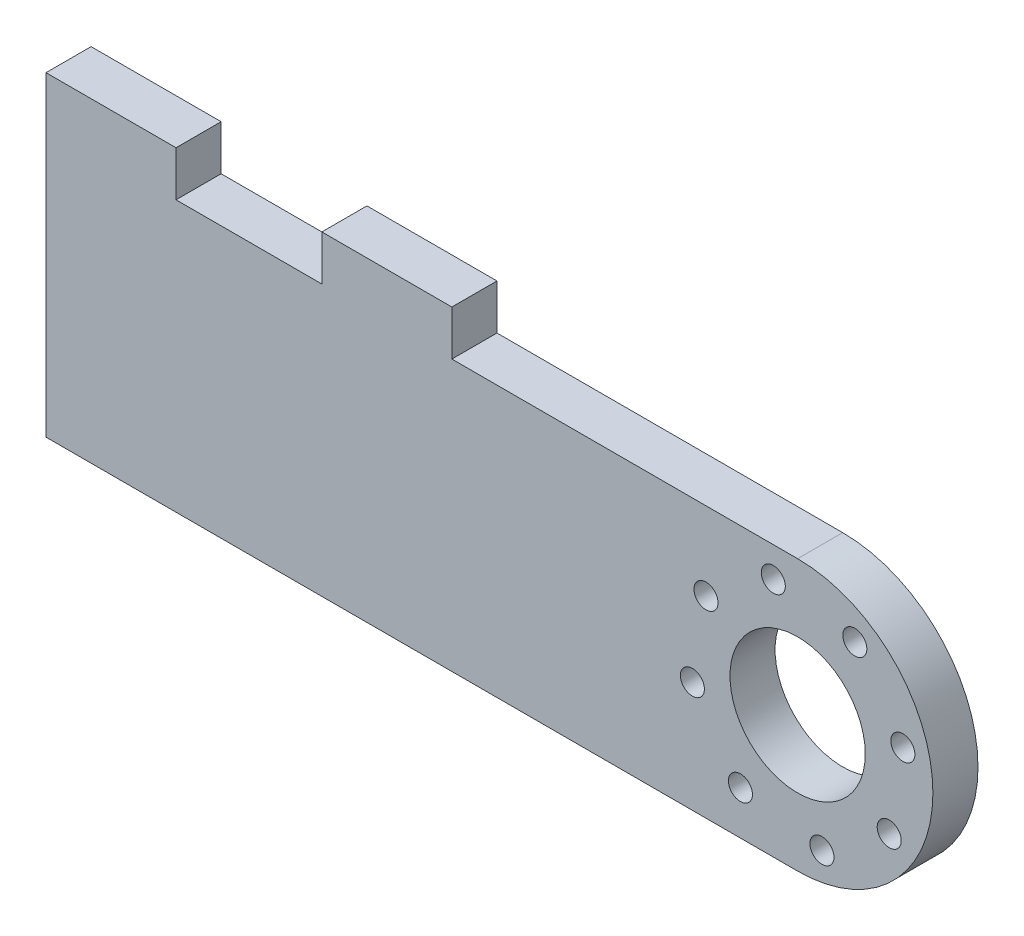
ISO-10303-21;
HEADER;
FILE_DESCRIPTION(('STEP AP214'),'2;1');
FILE_NAME('part.step','',(''),(''),'','','');
FILE_SCHEMA(('AUTOMOTIVE_DESIGN { 1 0 10303 214 1 1 1 1 }'));
ENDSEC;
DATA;
#1=APPLICATION_CONTEXT('core data for automotive mechanical design processes');
#2=APPLICATION_PROTOCOL_DEFINITION('international standard','automotive_design',2000,#1);
#3=PRODUCT_CONTEXT('',#1,'mechanical');
#4=PRODUCT('Part','Part','',(#3));
#5=PRODUCT_RELATED_PRODUCT_CATEGORY('part','',(#4));
#6=PRODUCT_DEFINITION_FORMATION('','',#4);
#7=PRODUCT_DEFINITION_CONTEXT('part definition',#1,'design');
#8=PRODUCT_DEFINITION('design','',#6,#7);
#9=PRODUCT_DEFINITION_SHAPE('','',#8);
#10=(LENGTH_UNIT() NAMED_UNIT(*) SI_UNIT(.MILLI.,.METRE.));
#11=(NAMED_UNIT(*) PLANE_ANGLE_UNIT() SI_UNIT($,.RADIAN.));
#12=(NAMED_UNIT(*) SI_UNIT($,.STERADIAN.) SOLID_ANGLE_UNIT());
#13=UNCERTAINTY_MEASURE_WITH_UNIT(LENGTH_MEASURE(1.E-05),#10,'distance_accuracy_value','');
#14=(GEOMETRIC_REPRESENTATION_CONTEXT(3) GLOBAL_UNCERTAINTY_ASSIGNED_CONTEXT((#13)) GLOBAL_UNIT_ASSIGNED_CONTEXT((#10,
#11,#12)) REPRESENTATION_CONTEXT('',''));
#15=CARTESIAN_POINT('',(0.,0.,0.));
#16=DIRECTION('',(0.,0.,1.));
#17=DIRECTION('',(1.,0.,0.));
#18=AXIS2_PLACEMENT_3D('',#15,#16,#17);
#19=CARTESIAN_POINT('',(24.5978346667474,0.,3.));
#20=DIRECTION('',(0.,0.,-1.));
#21=DIRECTION('',(-1.,0.,0.));
#22=AXIS2_PLACEMENT_3D('',#19,#20,#21);
#23=PLANE('',#22);
#24=DIRECTION('',(-1.,0.,0.));
#25=VECTOR('',#24,1.);
#26=CARTESIAN_POINT('',(1.59783466674739,12.,3.));
#27=LINE('',#26,#25);
#28=CARTESIAN_POINT('',(1.59783466674739,12.,3.));
#29=VERTEX_POINT('',#28);
#30=CARTESIAN_POINT('',(-7.05216533325261,12.,3.));
#31=VERTEX_POINT('',#30);
#32=EDGE_CURVE('E161',#29,#31,#27,.T.);
#33=ORIENTED_EDGE('',*,*,#32,.T.);
#34=DIRECTION('',(0.,-1.,0.));
#35=VECTOR('',#34,1.);
#36=CARTESIAN_POINT('',(-7.05216533325261,12.,3.));
#37=LINE('',#36,#35);
#38=CARTESIAN_POINT('',(-7.05216533325261,9.,3.));
#39=VERTEX_POINT('',#38);
#40=EDGE_CURVE('E99',#31,#39,#37,.T.);
#41=ORIENTED_EDGE('',*,*,#40,.T.);
#42=DIRECTION('',(-1.,0.,0.));
#43=VECTOR('',#42,1.);
#44=CARTESIAN_POINT('',(-7.05216533325261,9.,3.));
#45=LINE('',#44,#43);
#46=CARTESIAN_POINT('',(-16.7521653332526,8.99999999999999,3.));
#47=VERTEX_POINT('',#46);
#48=EDGE_CURVE('E182',#39,#47,#45,.T.);
#49=ORIENTED_EDGE('',*,*,#48,.T.);
#50=DIRECTION('',(0.,1.,0.));
#51=VECTOR('',#50,1.);
#52=CARTESIAN_POINT('',(-16.7521653332526,8.99999999999999,3.));
#53=LINE('',#52,#51);
#54=CARTESIAN_POINT('',(-16.7521653332526,12.,3.));
#55=VERTEX_POINT('',#54);
#56=EDGE_CURVE('E201',#47,#55,#53,.T.);
#57=ORIENTED_EDGE('',*,*,#56,.T.);
#58=DIRECTION('',(-1.,0.,0.));
#59=VECTOR('',#58,1.);
#60=CARTESIAN_POINT('',(-16.7521653332526,12.,3.));
#61=LINE('',#60,#59);
#62=CARTESIAN_POINT('',(-25.4021653332526,12.,3.));
#63=VERTEX_POINT('',#62);
#64=EDGE_CURVE('E198',#55,#63,#61,.T.);
#65=ORIENTED_EDGE('',*,*,#64,.T.);
#66=DIRECTION('',(0.,-1.,0.));
#67=VECTOR('',#66,1.);
#68=CARTESIAN_POINT('',(-25.4021653332526,12.,3.));
#69=LINE('',#68,#67);
#70=CARTESIAN_POINT('',(-25.4021653332526,-9.,3.));
#71=VERTEX_POINT('',#70);
#72=EDGE_CURVE('E200',#63,#71,#69,.T.);
#73=ORIENTED_EDGE('',*,*,#72,.T.);
#74=DIRECTION('',(1.,0.,0.));
#75=VECTOR('',#74,1.);
#76=CARTESIAN_POINT('',(-25.4021653332526,-9.,3.));
#77=LINE('',#76,#75);
#78=CARTESIAN_POINT('',(24.5978346667474,-9.,3.));
#79=VERTEX_POINT('',#78);
#80=EDGE_CURVE('E124',#71,#79,#77,.T.);
#81=ORIENTED_EDGE('',*,*,#80,.T.);
#82=CARTESIAN_POINT('',(24.5978346667474,0.,3.));
#83=DIRECTION('',(0.,0.,1.));
#84=DIRECTION('',(-1.,0.,0.));
#85=AXIS2_PLACEMENT_3D('',#82,#83,#84);
#86=CIRCLE('',#85,9.);
#87=CARTESIAN_POINT('',(24.5978346667474,9.,3.));
#88=VERTEX_POINT('',#87);
#89=EDGE_CURVE('E118',#79,#88,#86,.T.);
#90=ORIENTED_EDGE('',*,*,#89,.T.);
#91=DIRECTION('',(-1.,0.,0.));
#92=VECTOR('',#91,1.);
#93=CARTESIAN_POINT('',(1.59783466674739,9.,3.));
#94=LINE('',#93,#92);
#95=CARTESIAN_POINT('',(1.59783466674739,9.,3.));
#96=VERTEX_POINT('',#95);
#97=EDGE_CURVE('E122',#88,#96,#94,.T.);
#98=ORIENTED_EDGE('',*,*,#97,.T.);
#99=DIRECTION('',(0.,1.,0.));
#100=VECTOR('',#99,1.);
#101=CARTESIAN_POINT('',(1.59783466674739,9.,3.));
#102=LINE('',#101,#100);
#103=EDGE_CURVE('E50',#96,#29,#102,.T.);
#104=ORIENTED_EDGE('',*,*,#103,.T.);
#105=EDGE_LOOP('',(#33,#41,#49,#57,#65,#73,#81,#90,#98,#104));
#106=FACE_BOUND('',#105,.T.);
#107=CARTESIAN_POINT('',(24.5978346667474,0.,3.));
#108=DIRECTION('',(0.,0.,1.));
#109=DIRECTION('',(1.,0.,0.));
#110=AXIS2_PLACEMENT_3D('',#107,#108,#109);
#111=CIRCLE('',#110,4.5);
#112=CARTESIAN_POINT('',(29.0978346667474,0.,3.));
#113=VERTEX_POINT('',#112);
#114=EDGE_CURVE('E146',#113,#113,#111,.T.);
#115=ORIENTED_EDGE('',*,*,#114,.F.);
#116=EDGE_LOOP('',(#115));
#117=FACE_BOUND('',#116,.T.);
#118=CARTESIAN_POINT('',(22.9790707898904,7.,3.));
#119=DIRECTION('',(0.,0.,1.));
#120=DIRECTION('',(1.,0.,0.));
#121=AXIS2_PLACEMENT_3D('',#118,#119,#120);
#122=CIRCLE('',#121,0.799999999999999);
#123=CARTESIAN_POINT('',(23.7790707898904,7.,3.));
#124=VERTEX_POINT('',#123);
#125=EDGE_CURVE('E212',#124,#124,#122,.T.);
#126=ORIENTED_EDGE('',*,*,#125,.F.);
#127=EDGE_LOOP('',(#126));
#128=FACE_BOUND('',#127,.T.);
#129=CARTESIAN_POINT('',(28.4029432205878,6.09438638277143,3.));
#130=DIRECTION('',(0.,0.,1.));
#131=DIRECTION('',(1.,0.,0.));
#132=AXIS2_PLACEMENT_3D('',#129,#130,#131);
#133=CIRCLE('',#132,0.799999999999999);
#134=CARTESIAN_POINT('',(29.2029432205878,6.09438638277143,3.));
#135=VERTEX_POINT('',#134);
#136=EDGE_CURVE('E218',#135,#135,#133,.T.);
#137=ORIENTED_EDGE('',*,*,#136,.F.);
#138=EDGE_LOOP('',(#137));
#139=FACE_BOUND('',#138,.T.);
#140=CARTESIAN_POINT('',(31.5978346667476,1.61876387685727,3.));
#141=DIRECTION('',(0.,0.,1.));
#142=DIRECTION('',(1.,0.,0.));
#143=AXIS2_PLACEMENT_3D('',#140,#141,#142);
#144=CIRCLE('',#143,0.799999999999998);
#145=CARTESIAN_POINT('',(32.3978346667475,1.61876387685727,3.));
#146=VERTEX_POINT('',#145);
#147=EDGE_CURVE('E224',#146,#146,#144,.T.);
#148=ORIENTED_EDGE('',*,*,#147,.F.);
#149=EDGE_LOOP('',(#148));
#150=FACE_BOUND('',#149,.T.);
#151=CARTESIAN_POINT('',(30.6922210495189,-3.8051085538402,3.));
#152=DIRECTION('',(0.,0.,1.));
#153=DIRECTION('',(1.,0.,0.));
#154=AXIS2_PLACEMENT_3D('',#151,#152,#153);
#155=CIRCLE('',#154,0.799999999999999);
#156=CARTESIAN_POINT('',(31.492221049519,-3.8051085538402,3.));
#157=VERTEX_POINT('',#156);
#158=EDGE_CURVE('E230',#157,#157,#155,.T.);
#159=ORIENTED_EDGE('',*,*,#158,.F.);
#160=EDGE_LOOP('',(#159));
#161=FACE_BOUND('',#160,.T.);
#162=CARTESIAN_POINT('',(26.2165985436048,-6.99999999999992,3.));
#163=DIRECTION('',(0.,0.,1.));
#164=DIRECTION('',(1.,0.,0.));
#165=AXIS2_PLACEMENT_3D('',#162,#163,#164);
#166=CIRCLE('',#165,0.800000000000001);
#167=CARTESIAN_POINT('',(27.0165985436048,-6.99999999999992,3.));
#168=VERTEX_POINT('',#167);
#169=EDGE_CURVE('E236',#168,#168,#166,.T.);
#170=ORIENTED_EDGE('',*,*,#169,.F.);
#171=EDGE_LOOP('',(#170));
#172=FACE_BOUND('',#171,.T.);
#173=CARTESIAN_POINT('',(20.7927261129073,-6.09438638277132,3.));
#174=DIRECTION('',(0.,0.,1.));
#175=DIRECTION('',(1.,0.,0.));
#176=AXIS2_PLACEMENT_3D('',#173,#174,#175);
#177=CIRCLE('',#176,0.799999999999999);
#178=CARTESIAN_POINT('',(21.5927261129073,-6.09438638277132,3.));
#179=VERTEX_POINT('',#178);
#180=EDGE_CURVE('E242',#179,#179,#177,.T.);
#181=ORIENTED_EDGE('',*,*,#180,.F.);
#182=EDGE_LOOP('',(#181));
#183=FACE_BOUND('',#182,.T.);
#184=CARTESIAN_POINT('',(17.5978346667476,-1.61876387685712,3.));
#185=DIRECTION('',(0.,0.,1.));
#186=DIRECTION('',(1.,0.,0.));
#187=AXIS2_PLACEMENT_3D('',#184,#185,#186);
#188=CIRCLE('',#187,0.8);
#189=CARTESIAN_POINT('',(18.3978346667476,-1.61876387685712,3.));
#190=VERTEX_POINT('',#189);
#191=EDGE_CURVE('E248',#190,#190,#188,.T.);
#192=ORIENTED_EDGE('',*,*,#191,.F.);
#193=EDGE_LOOP('',(#192));
#194=FACE_BOUND('',#193,.T.);
#195=CARTESIAN_POINT('',(18.5034482839763,3.80510855384034,3.));
#196=DIRECTION('',(0.,0.,1.));
#197=DIRECTION('',(1.,0.,0.));
#198=AXIS2_PLACEMENT_3D('',#195,#196,#197);
#199=CIRCLE('',#198,0.799999999999999);
#200=CARTESIAN_POINT('',(19.3034482839763,3.80510855384034,3.));
#201=VERTEX_POINT('',#200);
#202=EDGE_CURVE('E254',#201,#201,#199,.T.);
#203=ORIENTED_EDGE('',*,*,#202,.F.);
#204=EDGE_LOOP('',(#203));
#205=FACE_BOUND('',#204,.T.);
#206=ADVANCED_FACE('F33',(#106,#117,#128,#139,#150,#161,#172,#183,#194,#205),#23,.F.);
#207=CARTESIAN_POINT('',(24.5978346667474,0.,0.));
#208=DIRECTION('',(0.,0.,-1.));
#209=DIRECTION('',(-1.,0.,0.));
#210=AXIS2_PLACEMENT_3D('',#207,#208,#209);
#211=PLANE('',#210);
#212=CARTESIAN_POINT('',(17.5978346667476,-1.61876387685712,0.));
#213=DIRECTION('',(0.,0.,1.));
#214=DIRECTION('',(1.,0.,0.));
#215=AXIS2_PLACEMENT_3D('',#212,#213,#214);
#216=CIRCLE('',#215,0.8);
#217=CARTESIAN_POINT('',(18.3978346667476,-1.61876387685712,0.));
#218=VERTEX_POINT('',#217);
#219=EDGE_CURVE('E251',#218,#218,#216,.T.);
#220=ORIENTED_EDGE('',*,*,#219,.T.);
#221=EDGE_LOOP('',(#220));
#222=FACE_BOUND('',#221,.T.);
#223=CARTESIAN_POINT('',(26.2165985436048,-6.99999999999992,0.));
#224=DIRECTION('',(0.,0.,1.));
#225=DIRECTION('',(1.,0.,0.));
#226=AXIS2_PLACEMENT_3D('',#223,#224,#225);
#227=CIRCLE('',#226,0.800000000000001);
#228=CARTESIAN_POINT('',(27.0165985436048,-6.99999999999992,0.));
#229=VERTEX_POINT('',#228);
#230=EDGE_CURVE('E239',#229,#229,#227,.T.);
#231=ORIENTED_EDGE('',*,*,#230,.T.);
#232=EDGE_LOOP('',(#231));
#233=FACE_BOUND('',#232,.T.);
#234=CARTESIAN_POINT('',(31.5978346667476,1.61876387685727,0.));
#235=DIRECTION('',(0.,0.,1.));
#236=DIRECTION('',(1.,0.,0.));
#237=AXIS2_PLACEMENT_3D('',#234,#235,#236);
#238=CIRCLE('',#237,0.799999999999998);
#239=CARTESIAN_POINT('',(32.3978346667475,1.61876387685727,0.));
#240=VERTEX_POINT('',#239);
#241=EDGE_CURVE('E227',#240,#240,#238,.T.);
#242=ORIENTED_EDGE('',*,*,#241,.T.);
#243=EDGE_LOOP('',(#242));
#244=FACE_BOUND('',#243,.T.);
#245=CARTESIAN_POINT('',(22.9790707898904,7.,0.));
#246=DIRECTION('',(0.,0.,1.));
#247=DIRECTION('',(1.,0.,0.));
#248=AXIS2_PLACEMENT_3D('',#245,#246,#247);
#249=CIRCLE('',#248,0.799999999999999);
#250=CARTESIAN_POINT('',(23.7790707898904,7.,0.));
#251=VERTEX_POINT('',#250);
#252=EDGE_CURVE('E215',#251,#251,#249,.T.);
#253=ORIENTED_EDGE('',*,*,#252,.T.);
#254=EDGE_LOOP('',(#253));
#255=FACE_BOUND('',#254,.T.);
#256=DIRECTION('',(-1.,0.,0.));
#257=VECTOR('',#256,1.);
#258=CARTESIAN_POINT('',(1.59783466674739,12.,0.));
#259=LINE('',#258,#257);
#260=CARTESIAN_POINT('',(1.59783466674739,12.,0.));
#261=VERTEX_POINT('',#260);
#262=CARTESIAN_POINT('',(-7.05216533325261,12.,0.));
#263=VERTEX_POINT('',#262);
#264=EDGE_CURVE('E142',#261,#263,#259,.T.);
#265=ORIENTED_EDGE('',*,*,#264,.F.);
#266=DIRECTION('',(0.,1.,0.));
#267=VECTOR('',#266,1.);
#268=CARTESIAN_POINT('',(1.59783466674739,9.,0.));
#269=LINE('',#268,#267);
#270=CARTESIAN_POINT('',(1.59783466674739,9.,0.));
#271=VERTEX_POINT('',#270);
#272=EDGE_CURVE('E91',#271,#261,#269,.T.);
#273=ORIENTED_EDGE('',*,*,#272,.F.);
#274=DIRECTION('',(-1.,0.,0.));
#275=VECTOR('',#274,1.);
#276=CARTESIAN_POINT('',(1.59783466674739,9.,0.));
#277=LINE('',#276,#275);
#278=CARTESIAN_POINT('',(24.5978346667474,9.,0.));
#279=VERTEX_POINT('',#278);
#280=EDGE_CURVE('E85',#279,#271,#277,.T.);
#281=ORIENTED_EDGE('',*,*,#280,.F.);
#282=CARTESIAN_POINT('',(24.5978346667474,0.,0.));
#283=DIRECTION('',(0.,0.,1.));
#284=DIRECTION('',(-1.,0.,0.));
#285=AXIS2_PLACEMENT_3D('',#282,#283,#284);
#286=CIRCLE('',#285,9.);
#287=CARTESIAN_POINT('',(24.5978346667474,-9.,0.));
#288=VERTEX_POINT('',#287);
#289=EDGE_CURVE('E132',#288,#279,#286,.T.);
#290=ORIENTED_EDGE('',*,*,#289,.F.);
#291=DIRECTION('',(1.,0.,0.));
#292=VECTOR('',#291,1.);
#293=CARTESIAN_POINT('',(-25.4021653332526,-9.,0.));
#294=LINE('',#293,#292);
#295=CARTESIAN_POINT('',(-25.4021653332526,-9.,0.));
#296=VERTEX_POINT('',#295);
#297=EDGE_CURVE('E156',#296,#288,#294,.T.);
#298=ORIENTED_EDGE('',*,*,#297,.F.);
#299=DIRECTION('',(0.,-1.,0.));
#300=VECTOR('',#299,1.);
#301=CARTESIAN_POINT('',(-25.4021653332526,12.,0.));
#302=LINE('',#301,#300);
#303=CARTESIAN_POINT('',(-25.4021653332526,12.,0.));
#304=VERTEX_POINT('',#303);
#305=EDGE_CURVE('E154',#304,#296,#302,.T.);
#306=ORIENTED_EDGE('',*,*,#305,.F.);
#307=DIRECTION('',(-1.,0.,0.));
#308=VECTOR('',#307,1.);
#309=CARTESIAN_POINT('',(-16.7521653332526,12.,0.));
#310=LINE('',#309,#308);
#311=CARTESIAN_POINT('',(-16.7521653332526,12.,0.));
#312=VERTEX_POINT('',#311);
#313=EDGE_CURVE('E152',#312,#304,#310,.T.);
#314=ORIENTED_EDGE('',*,*,#313,.F.);
#315=DIRECTION('',(0.,1.,0.));
#316=VECTOR('',#315,1.);
#317=CARTESIAN_POINT('',(-16.7521653332526,8.99999999999999,0.));
#318=LINE('',#317,#316);
#319=CARTESIAN_POINT('',(-16.7521653332526,8.99999999999999,0.));
#320=VERTEX_POINT('',#319);
#321=EDGE_CURVE('E150',#320,#312,#318,.T.);
#322=ORIENTED_EDGE('',*,*,#321,.F.);
#323=DIRECTION('',(-1.,0.,0.));
#324=VECTOR('',#323,1.);
#325=CARTESIAN_POINT('',(-7.05216533325261,9.,0.));
#326=LINE('',#325,#324);
#327=CARTESIAN_POINT('',(-7.05216533325261,9.,0.));
#328=VERTEX_POINT('',#327);
#329=EDGE_CURVE('E148',#328,#320,#326,.T.);
#330=ORIENTED_EDGE('',*,*,#329,.F.);
#331=DIRECTION('',(0.,-1.,0.));
#332=VECTOR('',#331,1.);
#333=CARTESIAN_POINT('',(-7.05216533325261,12.,0.));
#334=LINE('',#333,#332);
#335=EDGE_CURVE('E145',#263,#328,#334,.T.);
#336=ORIENTED_EDGE('',*,*,#335,.F.);
#337=EDGE_LOOP('',(#265,#273,#281,#290,#298,#306,#314,#322,#330,#336));
#338=FACE_BOUND('',#337,.T.);
#339=CARTESIAN_POINT('',(24.5978346667474,0.,0.));
#340=DIRECTION('',(0.,0.,1.));
#341=DIRECTION('',(1.,0.,0.));
#342=AXIS2_PLACEMENT_3D('',#339,#340,#341);
#343=CIRCLE('',#342,4.5);
#344=CARTESIAN_POINT('',(29.0978346667474,0.,0.));
#345=VERTEX_POINT('',#344);
#346=EDGE_CURVE('E209',#345,#345,#343,.T.);
#347=ORIENTED_EDGE('',*,*,#346,.T.);
#348=EDGE_LOOP('',(#347));
#349=FACE_BOUND('',#348,.T.);
#350=CARTESIAN_POINT('',(28.4029432205878,6.09438638277143,0.));
#351=DIRECTION('',(0.,0.,1.));
#352=DIRECTION('',(1.,0.,0.));
#353=AXIS2_PLACEMENT_3D('',#350,#351,#352);
#354=CIRCLE('',#353,0.799999999999999);
#355=CARTESIAN_POINT('',(29.2029432205878,6.09438638277143,0.));
#356=VERTEX_POINT('',#355);
#357=EDGE_CURVE('E221',#356,#356,#354,.T.);
#358=ORIENTED_EDGE('',*,*,#357,.T.);
#359=EDGE_LOOP('',(#358));
#360=FACE_BOUND('',#359,.T.);
#361=CARTESIAN_POINT('',(30.6922210495189,-3.8051085538402,0.));
#362=DIRECTION('',(0.,0.,1.));
#363=DIRECTION('',(1.,0.,0.));
#364=AXIS2_PLACEMENT_3D('',#361,#362,#363);
#365=CIRCLE('',#364,0.799999999999999);
#366=CARTESIAN_POINT('',(31.492221049519,-3.8051085538402,0.));
#367=VERTEX_POINT('',#366);
#368=EDGE_CURVE('E233',#367,#367,#365,.T.);
#369=ORIENTED_EDGE('',*,*,#368,.T.);
#370=EDGE_LOOP('',(#369));
#371=FACE_BOUND('',#370,.T.);
#372=CARTESIAN_POINT('',(20.7927261129073,-6.09438638277132,0.));
#373=DIRECTION('',(0.,0.,1.));
#374=DIRECTION('',(1.,0.,0.));
#375=AXIS2_PLACEMENT_3D('',#372,#373,#374);
#376=CIRCLE('',#375,0.799999999999999);
#377=CARTESIAN_POINT('',(21.5927261129073,-6.09438638277132,0.));
#378=VERTEX_POINT('',#377);
#379=EDGE_CURVE('E245',#378,#378,#376,.T.);
#380=ORIENTED_EDGE('',*,*,#379,.T.);
#381=EDGE_LOOP('',(#380));
#382=FACE_BOUND('',#381,.T.);
#383=CARTESIAN_POINT('',(18.5034482839763,3.80510855384034,0.));
#384=DIRECTION('',(0.,0.,1.));
#385=DIRECTION('',(1.,0.,0.));
#386=AXIS2_PLACEMENT_3D('',#383,#384,#385);
#387=CIRCLE('',#386,0.799999999999999);
#388=CARTESIAN_POINT('',(19.3034482839763,3.80510855384034,0.));
#389=VERTEX_POINT('',#388);
#390=EDGE_CURVE('E257',#389,#389,#387,.T.);
#391=ORIENTED_EDGE('',*,*,#390,.T.);
#392=EDGE_LOOP('',(#391));
#393=FACE_BOUND('',#392,.T.);
#394=ADVANCED_FACE('F186',(#222,#233,#244,#255,#338,#349,#360,#371,#382,#393),#211,.T.);
#395=CARTESIAN_POINT('',(1.59783466674739,12.,3.));
#396=DIRECTION('',(0.,-1.,0.));
#397=DIRECTION('',(1.,0.,0.));
#398=AXIS2_PLACEMENT_3D('',#395,#396,#397);
#399=PLANE('',#398);
#400=ORIENTED_EDGE('',*,*,#264,.T.);
#401=DIRECTION('',(0.,0.,-1.));
#402=VECTOR('',#401,1.);
#403=CARTESIAN_POINT('',(-7.05216533325261,12.,3.));
#404=LINE('',#403,#402);
#405=EDGE_CURVE('E11',#31,#263,#404,.T.);
#406=ORIENTED_EDGE('',*,*,#405,.F.);
#407=ORIENTED_EDGE('',*,*,#32,.F.);
#408=DIRECTION('',(0.,0.,-1.));
#409=VECTOR('',#408,1.);
#410=CARTESIAN_POINT('',(1.59783466674739,12.,3.));
#411=LINE('',#410,#409);
#412=EDGE_CURVE('E138',#29,#261,#411,.T.);
#413=ORIENTED_EDGE('',*,*,#412,.T.);
#414=EDGE_LOOP('',(#400,#406,#407,#413));
#415=FACE_BOUND('',#414,.T.);
#416=ADVANCED_FACE('F35',(#415),#399,.F.);
#417=CARTESIAN_POINT('',(-7.05216533325261,12.,3.));
#418=DIRECTION('',(1.,0.,0.));
#419=DIRECTION('',(0.,0.,-1.));
#420=AXIS2_PLACEMENT_3D('',#417,#418,#419);
#421=PLANE('',#420);
#422=ORIENTED_EDGE('',*,*,#335,.T.);
#423=DIRECTION('',(0.,0.,-1.));
#424=VECTOR('',#423,1.);
#425=CARTESIAN_POINT('',(-7.05216533325261,9.,3.));
#426=LINE('',#425,#424);
#427=EDGE_CURVE('E42',#39,#328,#426,.T.);
#428=ORIENTED_EDGE('',*,*,#427,.F.);
#429=ORIENTED_EDGE('',*,*,#40,.F.);
#430=ORIENTED_EDGE('',*,*,#405,.T.);
#431=EDGE_LOOP('',(#422,#428,#429,#430));
#432=FACE_BOUND('',#431,.T.);
#433=ADVANCED_FACE('F297',(#432),#421,.F.);
#434=CARTESIAN_POINT('',(-7.05216533325261,9.,3.));
#435=DIRECTION('',(0.,-1.,0.));
#436=DIRECTION('',(1.,0.,0.));
#437=AXIS2_PLACEMENT_3D('',#434,#435,#436);
#438=PLANE('',#437);
#439=ORIENTED_EDGE('',*,*,#329,.T.);
#440=DIRECTION('',(0.,0.,-1.));
#441=VECTOR('',#440,1.);
#442=CARTESIAN_POINT('',(-16.7521653332526,8.99999999999999,3.));
#443=LINE('',#442,#441);
#444=EDGE_CURVE('E174',#47,#320,#443,.T.);
#445=ORIENTED_EDGE('',*,*,#444,.F.);
#446=ORIENTED_EDGE('',*,*,#48,.F.);
#447=ORIENTED_EDGE('',*,*,#427,.T.);
#448=EDGE_LOOP('',(#439,#445,#446,#447));
#449=FACE_BOUND('',#448,.T.);
#450=ADVANCED_FACE('F180',(#449),#438,.F.);
#451=CARTESIAN_POINT('',(-16.7521653332526,8.99999999999999,3.));
#452=DIRECTION('',(-1.,0.,0.));
#453=DIRECTION('',(0.,0.,1.));
#454=AXIS2_PLACEMENT_3D('',#451,#452,#453);
#455=PLANE('',#454);
#456=ORIENTED_EDGE('',*,*,#321,.T.);
#457=DIRECTION('',(0.,0.,-1.));
#458=VECTOR('',#457,1.);
#459=CARTESIAN_POINT('',(-16.7521653332526,12.,3.));
#460=LINE('',#459,#458);
#461=EDGE_CURVE('E171',#55,#312,#460,.T.);
#462=ORIENTED_EDGE('',*,*,#461,.F.);
#463=ORIENTED_EDGE('',*,*,#56,.F.);
#464=ORIENTED_EDGE('',*,*,#444,.T.);
#465=EDGE_LOOP('',(#456,#462,#463,#464));
#466=FACE_BOUND('',#465,.T.);
#467=ADVANCED_FACE('F192',(#466),#455,.F.);
#468=CARTESIAN_POINT('',(-16.7521653332526,12.,3.));
#469=DIRECTION('',(0.,-1.,0.));
#470=DIRECTION('',(0.,0.,-1.));
#471=AXIS2_PLACEMENT_3D('',#468,#469,#470);
#472=PLANE('',#471);
#473=ORIENTED_EDGE('',*,*,#313,.T.);
#474=DIRECTION('',(0.,0.,-1.));
#475=VECTOR('',#474,1.);
#476=CARTESIAN_POINT('',(-25.4021653332526,12.,3.));
#477=LINE('',#476,#475);
#478=EDGE_CURVE('E168',#63,#304,#477,.T.);
#479=ORIENTED_EDGE('',*,*,#478,.F.);
#480=ORIENTED_EDGE('',*,*,#64,.F.);
#481=ORIENTED_EDGE('',*,*,#461,.T.);
#482=EDGE_LOOP('',(#473,#479,#480,#481));
#483=FACE_BOUND('',#482,.T.);
#484=ADVANCED_FACE('F196',(#483),#472,.F.);
#485=CARTESIAN_POINT('',(-25.4021653332526,12.,3.));
#486=DIRECTION('',(1.,0.,0.));
#487=DIRECTION('',(0.,1.,0.));
#488=AXIS2_PLACEMENT_3D('',#485,#486,#487);
#489=PLANE('',#488);
#490=ORIENTED_EDGE('',*,*,#305,.T.);
#491=DIRECTION('',(0.,0.,-1.));
#492=VECTOR('',#491,1.);
#493=CARTESIAN_POINT('',(-25.4021653332526,-9.,3.));
#494=LINE('',#493,#492);
#495=EDGE_CURVE('E165',#71,#296,#494,.T.);
#496=ORIENTED_EDGE('',*,*,#495,.F.);
#497=ORIENTED_EDGE('',*,*,#72,.F.);
#498=ORIENTED_EDGE('',*,*,#478,.T.);
#499=EDGE_LOOP('',(#490,#496,#497,#498));
#500=FACE_BOUND('',#499,.T.);
#501=ADVANCED_FACE('F287',(#500),#489,.F.);
#502=CARTESIAN_POINT('',(-25.4021653332526,-9.,3.));
#503=DIRECTION('',(0.,1.,0.));
#504=DIRECTION('',(-1.,0.,0.));
#505=AXIS2_PLACEMENT_3D('',#502,#503,#504);
#506=PLANE('',#505);
#507=ORIENTED_EDGE('',*,*,#297,.T.);
#508=DIRECTION('',(0.,0.,-1.));
#509=VECTOR('',#508,1.);
#510=CARTESIAN_POINT('',(24.5978346667474,-9.,3.));
#511=LINE('',#510,#509);
#512=EDGE_CURVE('E133',#79,#288,#511,.T.);
#513=ORIENTED_EDGE('',*,*,#512,.F.);
#514=ORIENTED_EDGE('',*,*,#80,.F.);
#515=ORIENTED_EDGE('',*,*,#495,.T.);
#516=EDGE_LOOP('',(#507,#513,#514,#515));
#517=FACE_BOUND('',#516,.T.);
#518=ADVANCED_FACE('F284',(#517),#506,.F.);
#519=CARTESIAN_POINT('',(24.5978346667474,0.,3.));
#520=DIRECTION('',(0.,0.,-1.));
#521=DIRECTION('',(-1.,0.,0.));
#522=AXIS2_PLACEMENT_3D('',#519,#520,#521);
#523=CYLINDRICAL_SURFACE('',#522,9.);
#524=ORIENTED_EDGE('',*,*,#289,.T.);
#525=DIRECTION('',(0.,0.,-1.));
#526=VECTOR('',#525,1.);
#527=CARTESIAN_POINT('',(24.5978346667474,9.,3.));
#528=LINE('',#527,#526);
#529=EDGE_CURVE('E129',#88,#279,#528,.T.);
#530=ORIENTED_EDGE('',*,*,#529,.F.);
#531=ORIENTED_EDGE('',*,*,#89,.F.);
#532=ORIENTED_EDGE('',*,*,#512,.T.);
#533=EDGE_LOOP('',(#524,#530,#531,#532));
#534=FACE_BOUND('',#533,.T.);
#535=ADVANCED_FACE('F130',(#534),#523,.T.);
#536=CARTESIAN_POINT('',(1.59783466674739,9.,3.));
#537=DIRECTION('',(0.,-1.,0.));
#538=DIRECTION('',(1.,0.,0.));
#539=AXIS2_PLACEMENT_3D('',#536,#537,#538);
#540=PLANE('',#539);
#541=ORIENTED_EDGE('',*,*,#280,.T.);
#542=DIRECTION('',(0.,0.,-1.));
#543=VECTOR('',#542,1.);
#544=CARTESIAN_POINT('',(1.59783466674739,9.,3.));
#545=LINE('',#544,#543);
#546=EDGE_CURVE('E134',#96,#271,#545,.T.);
#547=ORIENTED_EDGE('',*,*,#546,.F.);
#548=ORIENTED_EDGE('',*,*,#97,.F.);
#549=ORIENTED_EDGE('',*,*,#529,.T.);
#550=EDGE_LOOP('',(#541,#547,#548,#549));
#551=FACE_BOUND('',#550,.T.);
#552=ADVANCED_FACE('F136',(#551),#540,.F.);
#553=CARTESIAN_POINT('',(1.59783466674739,9.,3.));
#554=DIRECTION('',(-1.,0.,0.));
#555=DIRECTION('',(0.,-1.,0.));
#556=AXIS2_PLACEMENT_3D('',#553,#554,#555);
#557=PLANE('',#556);
#558=ORIENTED_EDGE('',*,*,#272,.T.);
#559=ORIENTED_EDGE('',*,*,#412,.F.);
#560=ORIENTED_EDGE('',*,*,#103,.F.);
#561=ORIENTED_EDGE('',*,*,#546,.T.);
#562=EDGE_LOOP('',(#558,#559,#560,#561));
#563=FACE_BOUND('',#562,.T.);
#564=ADVANCED_FACE('F277',(#563),#557,.F.);
#565=CARTESIAN_POINT('',(24.5978346667474,0.,3.));
#566=DIRECTION('',(0.,0.,-1.));
#567=DIRECTION('',(-1.,0.,0.));
#568=AXIS2_PLACEMENT_3D('',#565,#566,#567);
#569=CYLINDRICAL_SURFACE('',#568,4.5);
#570=ORIENTED_EDGE('',*,*,#114,.T.);
#571=EDGE_LOOP('',(#570));
#572=FACE_BOUND('',#571,.T.);
#573=ORIENTED_EDGE('',*,*,#346,.F.);
#574=EDGE_LOOP('',(#573));
#575=FACE_BOUND('',#574,.T.);
#576=ADVANCED_FACE('F274',(#572,#575),#569,.F.);
#577=CARTESIAN_POINT('',(22.9790707898904,7.,3.));
#578=DIRECTION('',(0.,0.,-1.));
#579=DIRECTION('',(-1.,0.,0.));
#580=AXIS2_PLACEMENT_3D('',#577,#578,#579);
#581=CYLINDRICAL_SURFACE('',#580,0.799999999999999);
#582=ORIENTED_EDGE('',*,*,#125,.T.);
#583=EDGE_LOOP('',(#582));
#584=FACE_BOUND('',#583,.T.);
#585=ORIENTED_EDGE('',*,*,#252,.F.);
#586=EDGE_LOOP('',(#585));
#587=FACE_BOUND('',#586,.T.);
#588=ADVANCED_FACE('F373',(#584,#587),#581,.F.);
#589=CARTESIAN_POINT('',(28.4029432205878,6.09438638277143,3.));
#590=DIRECTION('',(0.,0.,-1.));
#591=DIRECTION('',(-1.,0.,0.));
#592=AXIS2_PLACEMENT_3D('',#589,#590,#591);
#593=CYLINDRICAL_SURFACE('',#592,0.799999999999999);
#594=ORIENTED_EDGE('',*,*,#136,.T.);
#595=EDGE_LOOP('',(#594));
#596=FACE_BOUND('',#595,.T.);
#597=ORIENTED_EDGE('',*,*,#357,.F.);
#598=EDGE_LOOP('',(#597));
#599=FACE_BOUND('',#598,.T.);
#600=ADVANCED_FACE('F381',(#596,#599),#593,.F.);
#601=CARTESIAN_POINT('',(31.5978346667476,1.61876387685727,3.));
#602=DIRECTION('',(0.,0.,-1.));
#603=DIRECTION('',(-1.,0.,0.));
#604=AXIS2_PLACEMENT_3D('',#601,#602,#603);
#605=CYLINDRICAL_SURFACE('',#604,0.799999999999998);
#606=ORIENTED_EDGE('',*,*,#147,.T.);
#607=EDGE_LOOP('',(#606));
#608=FACE_BOUND('',#607,.T.);
#609=ORIENTED_EDGE('',*,*,#241,.F.);
#610=EDGE_LOOP('',(#609));
#611=FACE_BOUND('',#610,.T.);
#612=ADVANCED_FACE('F389',(#608,#611),#605,.F.);
#613=CARTESIAN_POINT('',(30.6922210495189,-3.8051085538402,3.));
#614=DIRECTION('',(0.,0.,-1.));
#615=DIRECTION('',(-1.,0.,0.));
#616=AXIS2_PLACEMENT_3D('',#613,#614,#615);
#617=CYLINDRICAL_SURFACE('',#616,0.799999999999999);
#618=ORIENTED_EDGE('',*,*,#158,.T.);
#619=EDGE_LOOP('',(#618));
#620=FACE_BOUND('',#619,.T.);
#621=ORIENTED_EDGE('',*,*,#368,.F.);
#622=EDGE_LOOP('',(#621));
#623=FACE_BOUND('',#622,.T.);
#624=ADVANCED_FACE('F398',(#620,#623),#617,.F.);
#625=CARTESIAN_POINT('',(26.2165985436048,-6.99999999999992,3.));
#626=DIRECTION('',(0.,0.,-1.));
#627=DIRECTION('',(-1.,0.,0.));
#628=AXIS2_PLACEMENT_3D('',#625,#626,#627);
#629=CYLINDRICAL_SURFACE('',#628,0.800000000000001);
#630=ORIENTED_EDGE('',*,*,#169,.T.);
#631=EDGE_LOOP('',(#630));
#632=FACE_BOUND('',#631,.T.);
#633=ORIENTED_EDGE('',*,*,#230,.F.);
#634=EDGE_LOOP('',(#633));
#635=FACE_BOUND('',#634,.T.);
#636=ADVANCED_FACE('F407',(#632,#635),#629,.F.);
#637=CARTESIAN_POINT('',(20.7927261129073,-6.09438638277132,3.));
#638=DIRECTION('',(0.,0.,-1.));
#639=DIRECTION('',(-1.,0.,0.));
#640=AXIS2_PLACEMENT_3D('',#637,#638,#639);
#641=CYLINDRICAL_SURFACE('',#640,0.799999999999999);
#642=ORIENTED_EDGE('',*,*,#180,.T.);
#643=EDGE_LOOP('',(#642));
#644=FACE_BOUND('',#643,.T.);
#645=ORIENTED_EDGE('',*,*,#379,.F.);
#646=EDGE_LOOP('',(#645));
#647=FACE_BOUND('',#646,.T.);
#648=ADVANCED_FACE('F416',(#644,#647),#641,.F.);
#649=CARTESIAN_POINT('',(17.5978346667476,-1.61876387685712,3.));
#650=DIRECTION('',(0.,0.,-1.));
#651=DIRECTION('',(-1.,0.,0.));
#652=AXIS2_PLACEMENT_3D('',#649,#650,#651);
#653=CYLINDRICAL_SURFACE('',#652,0.8);
#654=ORIENTED_EDGE('',*,*,#191,.T.);
#655=EDGE_LOOP('',(#654));
#656=FACE_BOUND('',#655,.T.);
#657=ORIENTED_EDGE('',*,*,#219,.F.);
#658=EDGE_LOOP('',(#657));
#659=FACE_BOUND('',#658,.T.);
#660=ADVANCED_FACE('F425',(#656,#659),#653,.F.);
#661=CARTESIAN_POINT('',(18.5034482839763,3.80510855384034,3.));
#662=DIRECTION('',(0.,0.,-1.));
#663=DIRECTION('',(-1.,0.,0.));
#664=AXIS2_PLACEMENT_3D('',#661,#662,#663);
#665=CYLINDRICAL_SURFACE('',#664,0.799999999999999);
#666=ORIENTED_EDGE('',*,*,#202,.T.);
#667=EDGE_LOOP('',(#666));
#668=FACE_BOUND('',#667,.T.);
#669=ORIENTED_EDGE('',*,*,#390,.F.);
#670=EDGE_LOOP('',(#669));
#671=FACE_BOUND('',#670,.T.);
#672=ADVANCED_FACE('F263',(#668,#671),#665,.F.);
#673=CLOSED_SHELL('',(#206,#394,#416,#433,#450,#467,#484,#501,#518,#535,#552,#564,#576,#588,
#600,#612,#624,#636,#648,#660,#672));
#674=MANIFOLD_SOLID_BREP('B2',#673);
#675=ADVANCED_BREP_SHAPE_REPRESENTATION('',(#18,#674),#14);
#676=SHAPE_DEFINITION_REPRESENTATION(#9,#675);
ENDSEC;
END-ISO-10303-21;
